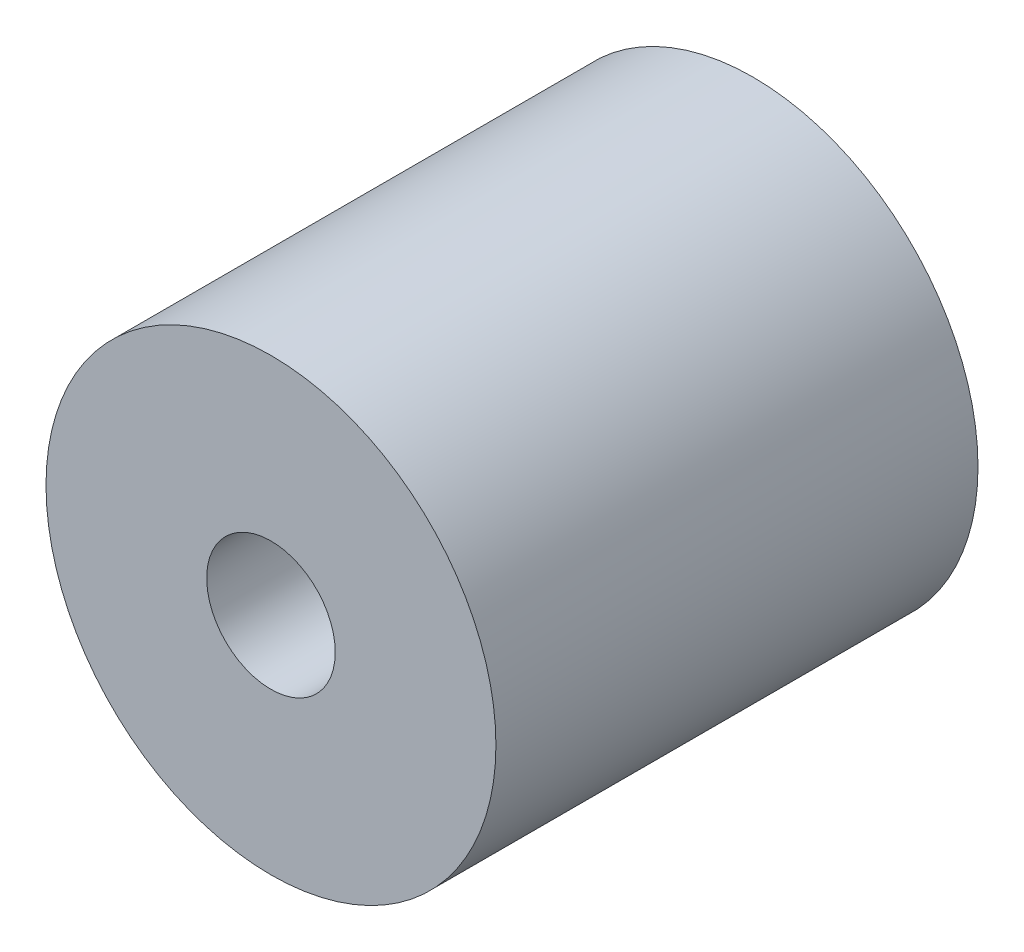
ISO-10303-21;
HEADER;
FILE_DESCRIPTION(('STEP AP214'),'2;1');
FILE_NAME('part.step','',(''),(''),'','','');
FILE_SCHEMA(('AUTOMOTIVE_DESIGN { 1 0 10303 214 1 1 1 1 }'));
ENDSEC;
DATA;
#1=APPLICATION_CONTEXT('core data for automotive mechanical design processes');
#2=APPLICATION_PROTOCOL_DEFINITION('international standard','automotive_design',2000,#1);
#3=PRODUCT_CONTEXT('',#1,'mechanical');
#4=PRODUCT('Part','Part','',(#3));
#5=PRODUCT_RELATED_PRODUCT_CATEGORY('part','',(#4));
#6=PRODUCT_DEFINITION_FORMATION('','',#4);
#7=PRODUCT_DEFINITION_CONTEXT('part definition',#1,'design');
#8=PRODUCT_DEFINITION('design','',#6,#7);
#9=PRODUCT_DEFINITION_SHAPE('','',#8);
#10=(LENGTH_UNIT() NAMED_UNIT(*) SI_UNIT(.MILLI.,.METRE.));
#11=(NAMED_UNIT(*) PLANE_ANGLE_UNIT() SI_UNIT($,.RADIAN.));
#12=(NAMED_UNIT(*) SI_UNIT($,.STERADIAN.) SOLID_ANGLE_UNIT());
#13=UNCERTAINTY_MEASURE_WITH_UNIT(LENGTH_MEASURE(1.E-05),#10,'distance_accuracy_value','');
#14=(GEOMETRIC_REPRESENTATION_CONTEXT(3) GLOBAL_UNCERTAINTY_ASSIGNED_CONTEXT((#13)) GLOBAL_UNIT_ASSIGNED_CONTEXT((#10,
#11,#12)) REPRESENTATION_CONTEXT('',''));
#15=CARTESIAN_POINT('',(0.,0.,0.));
#16=DIRECTION('',(0.,0.,1.));
#17=DIRECTION('',(1.,0.,0.));
#18=AXIS2_PLACEMENT_3D('',#15,#16,#17);
#19=CARTESIAN_POINT('',(0.,0.,0.));
#20=DIRECTION('',(0.,0.,1.));
#21=DIRECTION('',(1.,0.,0.));
#22=AXIS2_PLACEMENT_3D('',#19,#20,#21);
#23=PLANE('',#22);
#24=CARTESIAN_POINT('',(0.,0.,0.));
#25=DIRECTION('',(0.,0.,1.));
#26=DIRECTION('',(1.,0.,0.));
#27=AXIS2_PLACEMENT_3D('',#24,#25,#26);
#28=CIRCLE('',#27,7.);
#29=CARTESIAN_POINT('',(7.,0.,0.));
#30=VERTEX_POINT('',#29);
#31=EDGE_CURVE('E10',#30,#30,#28,.T.);
#32=ORIENTED_EDGE('',*,*,#31,.F.);
#33=EDGE_LOOP('',(#32));
#34=FACE_BOUND('',#33,.T.);
#35=CARTESIAN_POINT('',(0.,0.,0.));
#36=DIRECTION('',(0.,0.,1.));
#37=DIRECTION('',(1.,0.,0.));
#38=AXIS2_PLACEMENT_3D('',#35,#36,#37);
#39=CIRCLE('',#38,5.);
#40=CARTESIAN_POINT('',(5.,0.,0.));
#41=VERTEX_POINT('',#40);
#42=EDGE_CURVE('E51',#41,#41,#39,.T.);
#43=ORIENTED_EDGE('',*,*,#42,.T.);
#44=EDGE_LOOP('',(#43));
#45=FACE_BOUND('',#44,.T.);
#46=ADVANCED_FACE('F43',(#34,#45),#23,.F.);
#47=CARTESIAN_POINT('',(0.,0.,5.));
#48=DIRECTION('',(0.,0.,-1.));
#49=DIRECTION('',(-1.,0.,0.));
#50=AXIS2_PLACEMENT_3D('',#47,#48,#49);
#51=CYLINDRICAL_SURFACE('',#50,7.);
#52=CARTESIAN_POINT('',(0.,0.,15.));
#53=DIRECTION('',(0.,0.,1.));
#54=DIRECTION('',(1.,0.,0.));
#55=AXIS2_PLACEMENT_3D('',#52,#53,#54);
#56=CIRCLE('',#55,7.);
#57=CARTESIAN_POINT('',(7.,0.,15.));
#58=VERTEX_POINT('',#57);
#59=EDGE_CURVE('E61',#58,#58,#56,.T.);
#60=ORIENTED_EDGE('',*,*,#59,.F.);
#61=EDGE_LOOP('',(#60));
#62=FACE_BOUND('',#61,.T.);
#63=ORIENTED_EDGE('',*,*,#31,.T.);
#64=EDGE_LOOP('',(#63));
#65=FACE_BOUND('',#64,.T.);
#66=ADVANCED_FACE('F45',(#62,#65),#51,.T.);
#67=CARTESIAN_POINT('',(0.,0.,5.));
#68=DIRECTION('',(0.,0.,-1.));
#69=DIRECTION('',(-1.,0.,0.));
#70=AXIS2_PLACEMENT_3D('',#67,#68,#69);
#71=CYLINDRICAL_SURFACE('',#70,5.);
#72=CARTESIAN_POINT('',(0.,0.,5.));
#73=DIRECTION('',(0.,0.,1.));
#74=DIRECTION('',(1.,0.,0.));
#75=AXIS2_PLACEMENT_3D('',#72,#73,#74);
#76=CIRCLE('',#75,5.);
#77=CARTESIAN_POINT('',(5.,0.,5.));
#78=VERTEX_POINT('',#77);
#79=EDGE_CURVE('E56',#78,#78,#76,.T.);
#80=ORIENTED_EDGE('',*,*,#79,.T.);
#81=EDGE_LOOP('',(#80));
#82=FACE_BOUND('',#81,.T.);
#83=ORIENTED_EDGE('',*,*,#42,.F.);
#84=EDGE_LOOP('',(#83));
#85=FACE_BOUND('',#84,.T.);
#86=ADVANCED_FACE('F92',(#82,#85),#71,.F.);
#87=CARTESIAN_POINT('',(0.,0.,5.));
#88=DIRECTION('',(0.,0.,1.));
#89=DIRECTION('',(1.,0.,0.));
#90=AXIS2_PLACEMENT_3D('',#87,#88,#89);
#91=PLANE('',#90);
#92=ORIENTED_EDGE('',*,*,#79,.F.);
#93=EDGE_LOOP('',(#92));
#94=FACE_BOUND('',#93,.T.);
#95=ADVANCED_FACE('F87',(#94),#91,.F.);
#96=CARTESIAN_POINT('',(0.,0.,15.));
#97=DIRECTION('',(0.,0.,1.));
#98=DIRECTION('',(1.,0.,0.));
#99=AXIS2_PLACEMENT_3D('',#96,#97,#98);
#100=PLANE('',#99);
#101=CARTESIAN_POINT('',(0.,0.,15.));
#102=DIRECTION('',(0.,0.,1.));
#103=DIRECTION('',(1.,0.,0.));
#104=AXIS2_PLACEMENT_3D('',#101,#102,#103);
#105=CIRCLE('',#104,2.);
#106=CARTESIAN_POINT('',(2.,0.,15.));
#107=VERTEX_POINT('',#106);
#108=EDGE_CURVE('E68',#107,#107,#105,.T.);
#109=ORIENTED_EDGE('',*,*,#108,.F.);
#110=EDGE_LOOP('',(#109));
#111=FACE_BOUND('',#110,.T.);
#112=ORIENTED_EDGE('',*,*,#59,.T.);
#113=EDGE_LOOP('',(#112));
#114=FACE_BOUND('',#113,.T.);
#115=ADVANCED_FACE('F81',(#111,#114),#100,.T.);
#116=CARTESIAN_POINT('',(0.,0.,10.));
#117=DIRECTION('',(0.,0.,1.));
#118=DIRECTION('',(1.,0.,0.));
#119=AXIS2_PLACEMENT_3D('',#116,#117,#118);
#120=CYLINDRICAL_SURFACE('',#119,2.);
#121=CARTESIAN_POINT('',(0.,0.,10.));
#122=DIRECTION('',(0.,0.,1.));
#123=DIRECTION('',(1.,0.,0.));
#124=AXIS2_PLACEMENT_3D('',#121,#122,#123);
#125=CIRCLE('',#124,2.);
#126=CARTESIAN_POINT('',(2.,0.,10.));
#127=VERTEX_POINT('',#126);
#128=EDGE_CURVE('E67',#127,#127,#125,.T.);
#129=ORIENTED_EDGE('',*,*,#128,.F.);
#130=EDGE_LOOP('',(#129));
#131=FACE_BOUND('',#130,.T.);
#132=ORIENTED_EDGE('',*,*,#108,.T.);
#133=EDGE_LOOP('',(#132));
#134=FACE_BOUND('',#133,.T.);
#135=ADVANCED_FACE('F78',(#131,#134),#120,.F.);
#136=CARTESIAN_POINT('',(0.,0.,10.));
#137=DIRECTION('',(0.,0.,1.));
#138=DIRECTION('',(1.,0.,0.));
#139=AXIS2_PLACEMENT_3D('',#136,#137,#138);
#140=PLANE('',#139);
#141=ORIENTED_EDGE('',*,*,#128,.T.);
#142=EDGE_LOOP('',(#141));
#143=FACE_BOUND('',#142,.T.);
#144=ADVANCED_FACE('F76',(#143),#140,.T.);
#145=CLOSED_SHELL('',(#46,#66,#86,#95,#115,#135,#144));
#146=MANIFOLD_SOLID_BREP('B2',#145);
#147=ADVANCED_BREP_SHAPE_REPRESENTATION('',(#18,#146),#14);
#148=SHAPE_DEFINITION_REPRESENTATION(#9,#147);
ENDSEC;
END-ISO-10303-21;
